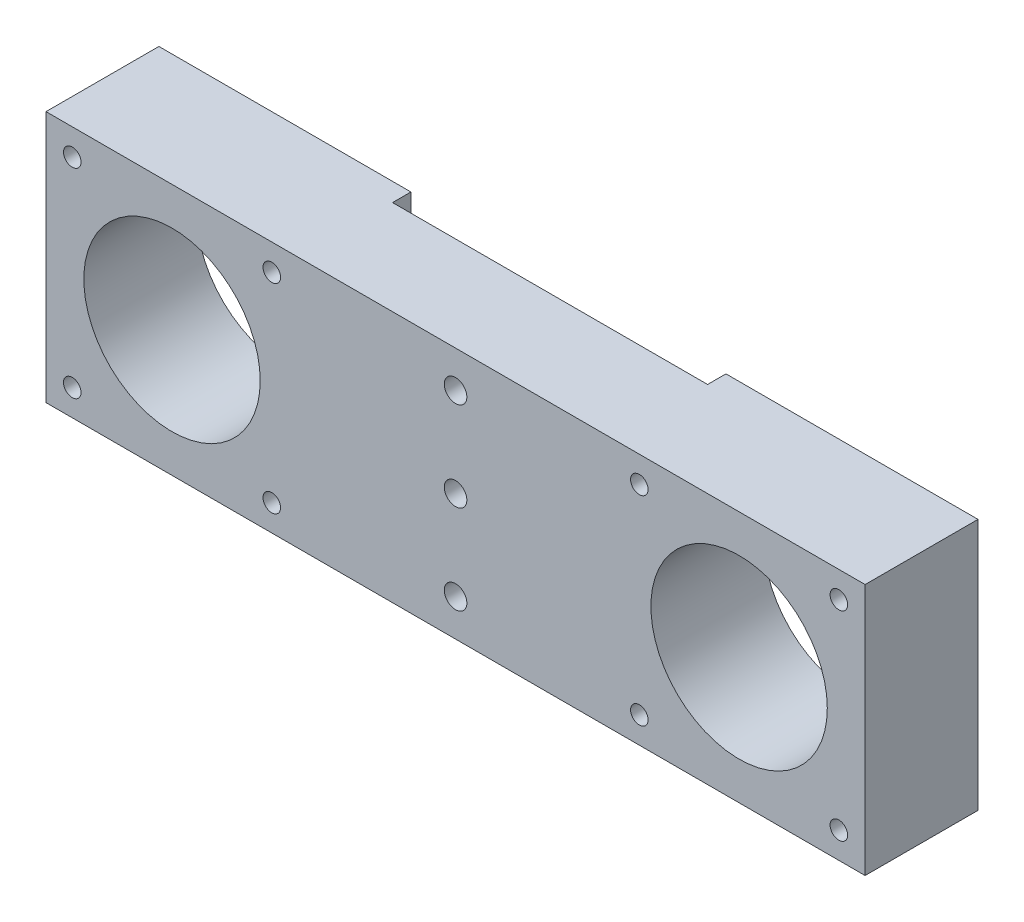
ISO-10303-21;
HEADER;
FILE_DESCRIPTION(('STEP AP214'),'2;1');
FILE_NAME('part.step','',(''),(''),'','','');
FILE_SCHEMA(('AUTOMOTIVE_DESIGN { 1 0 10303 214 1 1 1 1 }'));
ENDSEC;
DATA;
#1=APPLICATION_CONTEXT('core data for automotive mechanical design processes');
#2=APPLICATION_PROTOCOL_DEFINITION('international standard','automotive_design',2000,#1);
#3=PRODUCT_CONTEXT('',#1,'mechanical');
#4=PRODUCT('Part','Part','',(#3));
#5=PRODUCT_RELATED_PRODUCT_CATEGORY('part','',(#4));
#6=PRODUCT_DEFINITION_FORMATION('','',#4);
#7=PRODUCT_DEFINITION_CONTEXT('part definition',#1,'design');
#8=PRODUCT_DEFINITION('design','',#6,#7);
#9=PRODUCT_DEFINITION_SHAPE('','',#8);
#10=(LENGTH_UNIT() NAMED_UNIT(*) SI_UNIT(.MILLI.,.METRE.));
#11=(NAMED_UNIT(*) PLANE_ANGLE_UNIT() SI_UNIT($,.RADIAN.));
#12=(NAMED_UNIT(*) SI_UNIT($,.STERADIAN.) SOLID_ANGLE_UNIT());
#13=UNCERTAINTY_MEASURE_WITH_UNIT(LENGTH_MEASURE(1.E-05),#10,'distance_accuracy_value','');
#14=(GEOMETRIC_REPRESENTATION_CONTEXT(3) GLOBAL_UNCERTAINTY_ASSIGNED_CONTEXT((#13)) GLOBAL_UNIT_ASSIGNED_CONTEXT((#10,
#11,#12)) REPRESENTATION_CONTEXT('',''));
#15=CARTESIAN_POINT('',(0.,0.,0.));
#16=DIRECTION('',(0.,0.,1.));
#17=DIRECTION('',(1.,0.,0.));
#18=AXIS2_PLACEMENT_3D('',#15,#16,#17);
#19=CARTESIAN_POINT('',(0.,0.,21.5));
#20=DIRECTION('',(0.,0.,1.));
#21=DIRECTION('',(1.,0.,0.));
#22=AXIS2_PLACEMENT_3D('',#19,#20,#21);
#23=PLANE('',#22);
#24=CARTESIAN_POINT('',(19.,-19.,21.5));
#25=DIRECTION('',(0.,0.,1.));
#26=DIRECTION('',(1.,0.,0.));
#27=AXIS2_PLACEMENT_3D('',#24,#25,#26);
#28=CIRCLE('',#27,1.67000000000001);
#29=CARTESIAN_POINT('',(20.67,-19.,21.5));
#30=VERTEX_POINT('',#29);
#31=EDGE_CURVE('E140',#30,#30,#28,.T.);
#32=ORIENTED_EDGE('',*,*,#31,.F.);
#33=EDGE_LOOP('',(#32));
#34=FACE_BOUND('',#33,.T.);
#35=CARTESIAN_POINT('',(-19.,19.,21.5));
#36=DIRECTION('',(0.,0.,1.));
#37=DIRECTION('',(1.,0.,0.));
#38=AXIS2_PLACEMENT_3D('',#35,#36,#37);
#39=CIRCLE('',#38,1.67);
#40=CARTESIAN_POINT('',(-17.33,19.,21.5));
#41=VERTEX_POINT('',#40);
#42=EDGE_CURVE('E129',#41,#41,#39,.T.);
#43=ORIENTED_EDGE('',*,*,#42,.F.);
#44=EDGE_LOOP('',(#43));
#45=FACE_BOUND('',#44,.T.);
#46=DIRECTION('',(0.,-1.,0.));
#47=VECTOR('',#46,1.);
#48=CARTESIAN_POINT('',(-24.,-24.,21.5));
#49=LINE('',#48,#47);
#50=CARTESIAN_POINT('',(-24.,24.,21.5));
#51=VERTEX_POINT('',#50);
#52=CARTESIAN_POINT('',(-24.,-24.,21.5));
#53=VERTEX_POINT('',#52);
#54=EDGE_CURVE('E89',#51,#53,#49,.T.);
#55=ORIENTED_EDGE('',*,*,#54,.T.);
#56=DIRECTION('',(1.,0.,0.));
#57=VECTOR('',#56,1.);
#58=CARTESIAN_POINT('',(24.,-24.,21.5));
#59=LINE('',#58,#57);
#60=CARTESIAN_POINT('',(132.,-24.,21.5));
#61=VERTEX_POINT('',#60);
#62=EDGE_CURVE('E119',#53,#61,#59,.T.);
#63=ORIENTED_EDGE('',*,*,#62,.T.);
#64=DIRECTION('',(0.,1.,0.));
#65=VECTOR('',#64,1.);
#66=CARTESIAN_POINT('',(132.,-24.,21.5));
#67=LINE('',#66,#65);
#68=CARTESIAN_POINT('',(132.,24.,21.5));
#69=VERTEX_POINT('',#68);
#70=EDGE_CURVE('E189',#61,#69,#67,.T.);
#71=ORIENTED_EDGE('',*,*,#70,.T.);
#72=DIRECTION('',(-1.,0.,0.));
#73=VECTOR('',#72,1.);
#74=CARTESIAN_POINT('',(24.,24.,21.5));
#75=LINE('',#74,#73);
#76=EDGE_CURVE('E58',#69,#51,#75,.T.);
#77=ORIENTED_EDGE('',*,*,#76,.T.);
#78=EDGE_LOOP('',(#55,#63,#71,#77));
#79=FACE_BOUND('',#78,.T.);
#80=CARTESIAN_POINT('',(0.,0.,21.5));
#81=DIRECTION('',(0.,0.,1.));
#82=DIRECTION('',(1.,0.,0.));
#83=AXIS2_PLACEMENT_3D('',#80,#81,#82);
#84=CIRCLE('',#83,16.8);
#85=CARTESIAN_POINT('',(16.8,0.,21.5));
#86=VERTEX_POINT('',#85);
#87=EDGE_CURVE('E101',#86,#86,#84,.T.);
#88=ORIENTED_EDGE('',*,*,#87,.F.);
#89=EDGE_LOOP('',(#88));
#90=FACE_BOUND('',#89,.T.);
#91=CARTESIAN_POINT('',(19.,19.,21.5));
#92=DIRECTION('',(0.,0.,1.));
#93=DIRECTION('',(1.,0.,0.));
#94=AXIS2_PLACEMENT_3D('',#91,#92,#93);
#95=CIRCLE('',#94,1.67000000000001);
#96=CARTESIAN_POINT('',(20.67,19.,21.5));
#97=VERTEX_POINT('',#96);
#98=EDGE_CURVE('E134',#97,#97,#95,.T.);
#99=ORIENTED_EDGE('',*,*,#98,.F.);
#100=EDGE_LOOP('',(#99));
#101=FACE_BOUND('',#100,.T.);
#102=CARTESIAN_POINT('',(-19.,-19.,21.5));
#103=DIRECTION('',(0.,0.,1.));
#104=DIRECTION('',(1.,0.,0.));
#105=AXIS2_PLACEMENT_3D('',#102,#103,#104);
#106=CIRCLE('',#105,1.67);
#107=CARTESIAN_POINT('',(-17.33,-19.,21.5));
#108=VERTEX_POINT('',#107);
#109=EDGE_CURVE('E146',#108,#108,#106,.T.);
#110=ORIENTED_EDGE('',*,*,#109,.F.);
#111=EDGE_LOOP('',(#110));
#112=FACE_BOUND('',#111,.T.);
#113=CARTESIAN_POINT('',(54.,-17.,21.5));
#114=DIRECTION('',(0.,0.,1.));
#115=DIRECTION('',(1.,0.,0.));
#116=AXIS2_PLACEMENT_3D('',#113,#114,#115);
#117=CIRCLE('',#116,2.15);
#118=CARTESIAN_POINT('',(56.15,-17.,21.5));
#119=VERTEX_POINT('',#118);
#120=EDGE_CURVE('E174',#119,#119,#117,.T.);
#121=ORIENTED_EDGE('',*,*,#120,.F.);
#122=EDGE_LOOP('',(#121));
#123=FACE_BOUND('',#122,.T.);
#124=CARTESIAN_POINT('',(54.,0.,21.5));
#125=DIRECTION('',(0.,0.,1.));
#126=DIRECTION('',(1.,0.,0.));
#127=AXIS2_PLACEMENT_3D('',#124,#125,#126);
#128=CIRCLE('',#127,2.15);
#129=CARTESIAN_POINT('',(56.15,0.,21.5));
#130=VERTEX_POINT('',#129);
#131=EDGE_CURVE('E168',#130,#130,#128,.T.);
#132=ORIENTED_EDGE('',*,*,#131,.F.);
#133=EDGE_LOOP('',(#132));
#134=FACE_BOUND('',#133,.T.);
#135=CARTESIAN_POINT('',(54.,17.,21.5));
#136=DIRECTION('',(0.,0.,1.));
#137=DIRECTION('',(1.,0.,0.));
#138=AXIS2_PLACEMENT_3D('',#135,#136,#137);
#139=CIRCLE('',#138,2.15);
#140=CARTESIAN_POINT('',(56.15,17.,21.5));
#141=VERTEX_POINT('',#140);
#142=EDGE_CURVE('E162',#141,#141,#139,.T.);
#143=ORIENTED_EDGE('',*,*,#142,.F.);
#144=EDGE_LOOP('',(#143));
#145=FACE_BOUND('',#144,.T.);
#146=CARTESIAN_POINT('',(127.,-19.,21.5));
#147=DIRECTION('',(0.,0.,1.));
#148=DIRECTION('',(1.,0.,0.));
#149=AXIS2_PLACEMENT_3D('',#146,#147,#148);
#150=CIRCLE('',#149,1.67000000000001);
#151=CARTESIAN_POINT('',(128.67,-19.,21.5));
#152=VERTEX_POINT('',#151);
#153=EDGE_CURVE('E218',#152,#152,#150,.T.);
#154=ORIENTED_EDGE('',*,*,#153,.F.);
#155=EDGE_LOOP('',(#154));
#156=FACE_BOUND('',#155,.T.);
#157=CARTESIAN_POINT('',(89.,19.,21.5));
#158=DIRECTION('',(0.,0.,1.));
#159=DIRECTION('',(1.,0.,0.));
#160=AXIS2_PLACEMENT_3D('',#157,#158,#159);
#161=CIRCLE('',#160,1.67);
#162=CARTESIAN_POINT('',(90.67,19.,21.5));
#163=VERTEX_POINT('',#162);
#164=EDGE_CURVE('E206',#163,#163,#161,.T.);
#165=ORIENTED_EDGE('',*,*,#164,.F.);
#166=EDGE_LOOP('',(#165));
#167=FACE_BOUND('',#166,.T.);
#168=CARTESIAN_POINT('',(108.,0.,21.5));
#169=DIRECTION('',(0.,0.,1.));
#170=DIRECTION('',(1.,0.,0.));
#171=AXIS2_PLACEMENT_3D('',#168,#169,#170);
#172=CIRCLE('',#171,16.8);
#173=CARTESIAN_POINT('',(124.8,0.,21.5));
#174=VERTEX_POINT('',#173);
#175=EDGE_CURVE('E201',#174,#174,#172,.T.);
#176=ORIENTED_EDGE('',*,*,#175,.F.);
#177=EDGE_LOOP('',(#176));
#178=FACE_BOUND('',#177,.T.);
#179=CARTESIAN_POINT('',(127.,19.,21.5));
#180=DIRECTION('',(0.,0.,1.));
#181=DIRECTION('',(1.,0.,0.));
#182=AXIS2_PLACEMENT_3D('',#179,#180,#181);
#183=CIRCLE('',#182,1.67000000000001);
#184=CARTESIAN_POINT('',(128.67,19.,21.5));
#185=VERTEX_POINT('',#184);
#186=EDGE_CURVE('E212',#185,#185,#183,.T.);
#187=ORIENTED_EDGE('',*,*,#186,.F.);
#188=EDGE_LOOP('',(#187));
#189=FACE_BOUND('',#188,.T.);
#190=CARTESIAN_POINT('',(89.,-19.,21.5));
#191=DIRECTION('',(0.,0.,1.));
#192=DIRECTION('',(1.,0.,0.));
#193=AXIS2_PLACEMENT_3D('',#190,#191,#192);
#194=CIRCLE('',#193,1.67);
#195=CARTESIAN_POINT('',(90.67,-19.,21.5));
#196=VERTEX_POINT('',#195);
#197=EDGE_CURVE('E224',#196,#196,#194,.T.);
#198=ORIENTED_EDGE('',*,*,#197,.F.);
#199=EDGE_LOOP('',(#198));
#200=FACE_BOUND('',#199,.T.);
#201=ADVANCED_FACE('F34',(#34,#45,#79,#90,#101,#112,#123,#134,#145,#156,#167,#178,#189,#200),
#23,.T.);
#202=CARTESIAN_POINT('',(0.,0.,0.));
#203=DIRECTION('',(0.,0.,1.));
#204=DIRECTION('',(1.,0.,0.));
#205=AXIS2_PLACEMENT_3D('',#202,#203,#204);
#206=PLANE('',#205);
#207=DIRECTION('',(0.,-1.,0.));
#208=VECTOR('',#207,1.);
#209=CARTESIAN_POINT('',(-24.,-24.,0.));
#210=LINE('',#209,#208);
#211=CARTESIAN_POINT('',(-24.,24.,0.));
#212=VERTEX_POINT('',#211);
#213=CARTESIAN_POINT('',(-24.,-24.,0.));
#214=VERTEX_POINT('',#213);
#215=EDGE_CURVE('E95',#212,#214,#210,.T.);
#216=ORIENTED_EDGE('',*,*,#215,.F.);
#217=DIRECTION('',(-1.,0.,0.));
#218=VECTOR('',#217,1.);
#219=CARTESIAN_POINT('',(24.,24.,0.));
#220=LINE('',#219,#218);
#221=CARTESIAN_POINT('',(24.,24.,0.));
#222=VERTEX_POINT('',#221);
#223=EDGE_CURVE('E77',#222,#212,#220,.T.);
#224=ORIENTED_EDGE('',*,*,#223,.F.);
#225=DIRECTION('',(0.,1.,0.));
#226=VECTOR('',#225,1.);
#227=CARTESIAN_POINT('',(24.,-24.,0.));
#228=LINE('',#227,#226);
#229=CARTESIAN_POINT('',(24.,-24.,0.));
#230=VERTEX_POINT('',#229);
#231=EDGE_CURVE('E90',#230,#222,#228,.T.);
#232=ORIENTED_EDGE('',*,*,#231,.F.);
#233=DIRECTION('',(1.,0.,0.));
#234=VECTOR('',#233,1.);
#235=CARTESIAN_POINT('',(24.,-24.,0.));
#236=LINE('',#235,#234);
#237=EDGE_CURVE('E100',#214,#230,#236,.T.);
#238=ORIENTED_EDGE('',*,*,#237,.F.);
#239=EDGE_LOOP('',(#216,#224,#232,#238));
#240=FACE_BOUND('',#239,.T.);
#241=CARTESIAN_POINT('',(0.,0.,0.));
#242=DIRECTION('',(0.,0.,1.));
#243=DIRECTION('',(1.,0.,0.));
#244=AXIS2_PLACEMENT_3D('',#241,#242,#243);
#245=CIRCLE('',#244,16.8);
#246=CARTESIAN_POINT('',(16.8,0.,0.));
#247=VERTEX_POINT('',#246);
#248=EDGE_CURVE('E105',#247,#247,#245,.T.);
#249=ORIENTED_EDGE('',*,*,#248,.T.);
#250=EDGE_LOOP('',(#249));
#251=FACE_BOUND('',#250,.T.);
#252=CARTESIAN_POINT('',(-19.,19.,0.));
#253=DIRECTION('',(0.,0.,1.));
#254=DIRECTION('',(1.,0.,0.));
#255=AXIS2_PLACEMENT_3D('',#252,#253,#254);
#256=CIRCLE('',#255,1.67);
#257=CARTESIAN_POINT('',(-17.33,19.,0.));
#258=VERTEX_POINT('',#257);
#259=EDGE_CURVE('E131',#258,#258,#256,.T.);
#260=ORIENTED_EDGE('',*,*,#259,.T.);
#261=EDGE_LOOP('',(#260));
#262=FACE_BOUND('',#261,.T.);
#263=CARTESIAN_POINT('',(19.,19.,0.));
#264=DIRECTION('',(0.,0.,1.));
#265=DIRECTION('',(1.,0.,0.));
#266=AXIS2_PLACEMENT_3D('',#263,#264,#265);
#267=CIRCLE('',#266,1.67000000000001);
#268=CARTESIAN_POINT('',(20.67,19.,0.));
#269=VERTEX_POINT('',#268);
#270=EDGE_CURVE('E137',#269,#269,#267,.T.);
#271=ORIENTED_EDGE('',*,*,#270,.T.);
#272=EDGE_LOOP('',(#271));
#273=FACE_BOUND('',#272,.T.);
#274=CARTESIAN_POINT('',(19.,-19.,0.));
#275=DIRECTION('',(0.,0.,1.));
#276=DIRECTION('',(1.,0.,0.));
#277=AXIS2_PLACEMENT_3D('',#274,#275,#276);
#278=CIRCLE('',#277,1.67000000000001);
#279=CARTESIAN_POINT('',(20.67,-19.,0.));
#280=VERTEX_POINT('',#279);
#281=EDGE_CURVE('E143',#280,#280,#278,.T.);
#282=ORIENTED_EDGE('',*,*,#281,.T.);
#283=EDGE_LOOP('',(#282));
#284=FACE_BOUND('',#283,.T.);
#285=CARTESIAN_POINT('',(-19.,-19.,0.));
#286=DIRECTION('',(0.,0.,1.));
#287=DIRECTION('',(1.,0.,0.));
#288=AXIS2_PLACEMENT_3D('',#285,#286,#287);
#289=CIRCLE('',#288,1.67);
#290=CARTESIAN_POINT('',(-17.33,-19.,0.));
#291=VERTEX_POINT('',#290);
#292=EDGE_CURVE('E149',#291,#291,#289,.T.);
#293=ORIENTED_EDGE('',*,*,#292,.T.);
#294=EDGE_LOOP('',(#293));
#295=FACE_BOUND('',#294,.T.);
#296=ADVANCED_FACE('F97',(#240,#251,#262,#273,#284,#295),#206,.F.);
#297=CARTESIAN_POINT('',(-24.,-24.,21.5));
#298=DIRECTION('',(1.,0.,0.));
#299=DIRECTION('',(0.,0.,-1.));
#300=AXIS2_PLACEMENT_3D('',#297,#298,#299);
#301=PLANE('',#300);
#302=ORIENTED_EDGE('',*,*,#215,.T.);
#303=DIRECTION('',(0.,0.,-1.));
#304=VECTOR('',#303,1.);
#305=CARTESIAN_POINT('',(-24.,-24.,21.5));
#306=LINE('',#305,#304);
#307=EDGE_CURVE('E11',#53,#214,#306,.T.);
#308=ORIENTED_EDGE('',*,*,#307,.F.);
#309=ORIENTED_EDGE('',*,*,#54,.F.);
#310=DIRECTION('',(0.,0.,-1.));
#311=VECTOR('',#310,1.);
#312=CARTESIAN_POINT('',(-24.,24.,21.5));
#313=LINE('',#312,#311);
#314=EDGE_CURVE('E80',#51,#212,#313,.T.);
#315=ORIENTED_EDGE('',*,*,#314,.T.);
#316=EDGE_LOOP('',(#302,#308,#309,#315));
#317=FACE_BOUND('',#316,.T.);
#318=ADVANCED_FACE('F36',(#317),#301,.F.);
#319=CARTESIAN_POINT('',(24.,-24.,21.5));
#320=DIRECTION('',(0.,1.,0.));
#321=DIRECTION('',(-1.,0.,0.));
#322=AXIS2_PLACEMENT_3D('',#319,#320,#321);
#323=PLANE('',#322);
#324=ORIENTED_EDGE('',*,*,#237,.T.);
#325=DIRECTION('',(0.,0.,-1.));
#326=VECTOR('',#325,1.);
#327=CARTESIAN_POINT('',(24.,-24.,21.5));
#328=LINE('',#327,#326);
#329=CARTESIAN_POINT('',(24.,-24.,3.5));
#330=VERTEX_POINT('',#329);
#331=EDGE_CURVE('E42',#330,#230,#328,.T.);
#332=ORIENTED_EDGE('',*,*,#331,.F.);
#333=DIRECTION('',(1.,0.,0.));
#334=VECTOR('',#333,1.);
#335=CARTESIAN_POINT('',(24.,-24.,3.5));
#336=LINE('',#335,#334);
#337=CARTESIAN_POINT('',(84.,-24.,3.5));
#338=VERTEX_POINT('',#337);
#339=EDGE_CURVE('E49',#330,#338,#336,.T.);
#340=ORIENTED_EDGE('',*,*,#339,.T.);
#341=DIRECTION('',(0.,0.,-1.));
#342=VECTOR('',#341,1.);
#343=CARTESIAN_POINT('',(84.,-24.,21.5));
#344=LINE('',#343,#342);
#345=CARTESIAN_POINT('',(84.,-24.,0.));
#346=VERTEX_POINT('',#345);
#347=EDGE_CURVE('E177',#338,#346,#344,.T.);
#348=ORIENTED_EDGE('',*,*,#347,.T.);
#349=DIRECTION('',(1.,0.,0.));
#350=VECTOR('',#349,1.);
#351=CARTESIAN_POINT('',(132.,-24.,0.));
#352=LINE('',#351,#350);
#353=CARTESIAN_POINT('',(132.,-24.,0.));
#354=VERTEX_POINT('',#353);
#355=EDGE_CURVE('E196',#346,#354,#352,.T.);
#356=ORIENTED_EDGE('',*,*,#355,.T.);
#357=DIRECTION('',(0.,0.,-1.));
#358=VECTOR('',#357,1.);
#359=CARTESIAN_POINT('',(132.,-24.,21.5));
#360=LINE('',#359,#358);
#361=EDGE_CURVE('E123',#61,#354,#360,.T.);
#362=ORIENTED_EDGE('',*,*,#361,.F.);
#363=ORIENTED_EDGE('',*,*,#62,.F.);
#364=ORIENTED_EDGE('',*,*,#307,.T.);
#365=EDGE_LOOP('',(#324,#332,#340,#348,#356,#362,#363,#364));
#366=FACE_BOUND('',#365,.T.);
#367=ADVANCED_FACE('F116',(#366),#323,.F.);
#368=CARTESIAN_POINT('',(24.,-24.,21.5));
#369=DIRECTION('',(-1.,0.,0.));
#370=DIRECTION('',(0.,0.,1.));
#371=AXIS2_PLACEMENT_3D('',#368,#369,#370);
#372=PLANE('',#371);
#373=DIRECTION('',(0.,0.,-1.));
#374=VECTOR('',#373,1.);
#375=CARTESIAN_POINT('',(24.,24.,21.5));
#376=LINE('',#375,#374);
#377=CARTESIAN_POINT('',(24.,24.,3.5));
#378=VERTEX_POINT('',#377);
#379=EDGE_CURVE('E84',#378,#222,#376,.T.);
#380=ORIENTED_EDGE('',*,*,#379,.F.);
#381=DIRECTION('',(0.,-1.,0.));
#382=VECTOR('',#381,1.);
#383=CARTESIAN_POINT('',(24.,24.,3.5));
#384=LINE('',#383,#382);
#385=EDGE_CURVE('E114',#378,#330,#384,.T.);
#386=ORIENTED_EDGE('',*,*,#385,.T.);
#387=ORIENTED_EDGE('',*,*,#331,.T.);
#388=ORIENTED_EDGE('',*,*,#231,.T.);
#389=EDGE_LOOP('',(#380,#386,#387,#388));
#390=FACE_BOUND('',#389,.T.);
#391=ADVANCED_FACE('F113',(#390),#372,.F.);
#392=CARTESIAN_POINT('',(24.,24.,21.5));
#393=DIRECTION('',(0.,-1.,0.));
#394=DIRECTION('',(1.,0.,0.));
#395=AXIS2_PLACEMENT_3D('',#392,#393,#394);
#396=PLANE('',#395);
#397=ORIENTED_EDGE('',*,*,#223,.T.);
#398=ORIENTED_EDGE('',*,*,#314,.F.);
#399=ORIENTED_EDGE('',*,*,#76,.F.);
#400=DIRECTION('',(0.,0.,-1.));
#401=VECTOR('',#400,1.);
#402=CARTESIAN_POINT('',(132.,24.,21.5));
#403=LINE('',#402,#401);
#404=CARTESIAN_POINT('',(132.,24.,0.));
#405=VERTEX_POINT('',#404);
#406=EDGE_CURVE('E183',#69,#405,#403,.T.);
#407=ORIENTED_EDGE('',*,*,#406,.T.);
#408=DIRECTION('',(-1.,0.,0.));
#409=VECTOR('',#408,1.);
#410=CARTESIAN_POINT('',(132.,24.,0.));
#411=LINE('',#410,#409);
#412=CARTESIAN_POINT('',(84.,24.,0.));
#413=VERTEX_POINT('',#412);
#414=EDGE_CURVE('E190',#405,#413,#411,.T.);
#415=ORIENTED_EDGE('',*,*,#414,.T.);
#416=DIRECTION('',(0.,0.,-1.));
#417=VECTOR('',#416,1.);
#418=CARTESIAN_POINT('',(84.,24.,21.5));
#419=LINE('',#418,#417);
#420=CARTESIAN_POINT('',(84.,24.,3.5));
#421=VERTEX_POINT('',#420);
#422=EDGE_CURVE('E186',#421,#413,#419,.T.);
#423=ORIENTED_EDGE('',*,*,#422,.F.);
#424=DIRECTION('',(-1.,0.,0.));
#425=VECTOR('',#424,1.);
#426=CARTESIAN_POINT('',(84.,24.,3.5));
#427=LINE('',#426,#425);
#428=EDGE_CURVE('E156',#421,#378,#427,.T.);
#429=ORIENTED_EDGE('',*,*,#428,.T.);
#430=ORIENTED_EDGE('',*,*,#379,.T.);
#431=EDGE_LOOP('',(#397,#398,#399,#407,#415,#423,#429,#430));
#432=FACE_BOUND('',#431,.T.);
#433=ADVANCED_FACE('F79',(#432),#396,.F.);
#434=CARTESIAN_POINT('',(0.,0.,21.5));
#435=DIRECTION('',(0.,0.,-1.));
#436=DIRECTION('',(-1.,0.,0.));
#437=AXIS2_PLACEMENT_3D('',#434,#435,#436);
#438=CYLINDRICAL_SURFACE('',#437,16.8);
#439=ORIENTED_EDGE('',*,*,#87,.T.);
#440=EDGE_LOOP('',(#439));
#441=FACE_BOUND('',#440,.T.);
#442=ORIENTED_EDGE('',*,*,#248,.F.);
#443=EDGE_LOOP('',(#442));
#444=FACE_BOUND('',#443,.T.);
#445=ADVANCED_FACE('F246',(#441,#444),#438,.F.);
#446=CARTESIAN_POINT('',(-19.,19.,21.5));
#447=DIRECTION('',(0.,0.,-1.));
#448=DIRECTION('',(-1.,0.,0.));
#449=AXIS2_PLACEMENT_3D('',#446,#447,#448);
#450=CYLINDRICAL_SURFACE('',#449,1.67);
#451=ORIENTED_EDGE('',*,*,#42,.T.);
#452=EDGE_LOOP('',(#451));
#453=FACE_BOUND('',#452,.T.);
#454=ORIENTED_EDGE('',*,*,#259,.F.);
#455=EDGE_LOOP('',(#454));
#456=FACE_BOUND('',#455,.T.);
#457=ADVANCED_FACE('F300',(#453,#456),#450,.F.);
#458=CARTESIAN_POINT('',(19.,19.,21.5));
#459=DIRECTION('',(0.,0.,-1.));
#460=DIRECTION('',(-1.,0.,0.));
#461=AXIS2_PLACEMENT_3D('',#458,#459,#460);
#462=CYLINDRICAL_SURFACE('',#461,1.67000000000001);
#463=ORIENTED_EDGE('',*,*,#98,.T.);
#464=EDGE_LOOP('',(#463));
#465=FACE_BOUND('',#464,.T.);
#466=ORIENTED_EDGE('',*,*,#270,.F.);
#467=EDGE_LOOP('',(#466));
#468=FACE_BOUND('',#467,.T.);
#469=ADVANCED_FACE('F308',(#465,#468),#462,.F.);
#470=CARTESIAN_POINT('',(19.,-19.,21.5));
#471=DIRECTION('',(0.,0.,-1.));
#472=DIRECTION('',(-1.,0.,0.));
#473=AXIS2_PLACEMENT_3D('',#470,#471,#472);
#474=CYLINDRICAL_SURFACE('',#473,1.67000000000001);
#475=ORIENTED_EDGE('',*,*,#31,.T.);
#476=EDGE_LOOP('',(#475));
#477=FACE_BOUND('',#476,.T.);
#478=ORIENTED_EDGE('',*,*,#281,.F.);
#479=EDGE_LOOP('',(#478));
#480=FACE_BOUND('',#479,.T.);
#481=ADVANCED_FACE('F316',(#477,#480),#474,.F.);
#482=CARTESIAN_POINT('',(-19.,-19.,21.5));
#483=DIRECTION('',(0.,0.,-1.));
#484=DIRECTION('',(-1.,0.,0.));
#485=AXIS2_PLACEMENT_3D('',#482,#483,#484);
#486=CYLINDRICAL_SURFACE('',#485,1.67);
#487=ORIENTED_EDGE('',*,*,#109,.T.);
#488=EDGE_LOOP('',(#487));
#489=FACE_BOUND('',#488,.T.);
#490=ORIENTED_EDGE('',*,*,#292,.F.);
#491=EDGE_LOOP('',(#490));
#492=FACE_BOUND('',#491,.T.);
#493=ADVANCED_FACE('F325',(#489,#492),#486,.F.);
#494=CARTESIAN_POINT('',(0.,0.,3.5));
#495=DIRECTION('',(0.,0.,1.));
#496=DIRECTION('',(1.,0.,0.));
#497=AXIS2_PLACEMENT_3D('',#494,#495,#496);
#498=PLANE('',#497);
#499=CARTESIAN_POINT('',(54.,-17.,3.5));
#500=DIRECTION('',(0.,0.,1.));
#501=DIRECTION('',(1.,0.,0.));
#502=AXIS2_PLACEMENT_3D('',#499,#500,#501);
#503=CIRCLE('',#502,2.15);
#504=CARTESIAN_POINT('',(56.15,-17.,3.5));
#505=VERTEX_POINT('',#504);
#506=EDGE_CURVE('E171',#505,#505,#503,.T.);
#507=ORIENTED_EDGE('',*,*,#506,.T.);
#508=EDGE_LOOP('',(#507));
#509=FACE_BOUND('',#508,.T.);
#510=CARTESIAN_POINT('',(54.,0.,3.5));
#511=DIRECTION('',(0.,0.,1.));
#512=DIRECTION('',(1.,0.,0.));
#513=AXIS2_PLACEMENT_3D('',#510,#511,#512);
#514=CIRCLE('',#513,2.15);
#515=CARTESIAN_POINT('',(56.15,0.,3.5));
#516=VERTEX_POINT('',#515);
#517=EDGE_CURVE('E165',#516,#516,#514,.T.);
#518=ORIENTED_EDGE('',*,*,#517,.T.);
#519=EDGE_LOOP('',(#518));
#520=FACE_BOUND('',#519,.T.);
#521=CARTESIAN_POINT('',(54.,17.,3.5));
#522=DIRECTION('',(0.,0.,1.));
#523=DIRECTION('',(1.,0.,0.));
#524=AXIS2_PLACEMENT_3D('',#521,#522,#523);
#525=CIRCLE('',#524,2.15);
#526=CARTESIAN_POINT('',(56.15,17.,3.5));
#527=VERTEX_POINT('',#526);
#528=EDGE_CURVE('E161',#527,#527,#525,.T.);
#529=ORIENTED_EDGE('',*,*,#528,.T.);
#530=EDGE_LOOP('',(#529));
#531=FACE_BOUND('',#530,.T.);
#532=DIRECTION('',(0.,1.,0.));
#533=VECTOR('',#532,1.);
#534=CARTESIAN_POINT('',(84.,-24.,3.5));
#535=LINE('',#534,#533);
#536=EDGE_CURVE('E158',#338,#421,#535,.T.);
#537=ORIENTED_EDGE('',*,*,#536,.F.);
#538=ORIENTED_EDGE('',*,*,#339,.F.);
#539=ORIENTED_EDGE('',*,*,#385,.F.);
#540=ORIENTED_EDGE('',*,*,#428,.F.);
#541=EDGE_LOOP('',(#537,#538,#539,#540));
#542=FACE_BOUND('',#541,.T.);
#543=ADVANCED_FACE('F332',(#509,#520,#531,#542),#498,.F.);
#544=CARTESIAN_POINT('',(54.,17.,3.5));
#545=DIRECTION('',(0.,0.,1.));
#546=DIRECTION('',(1.,0.,0.));
#547=AXIS2_PLACEMENT_3D('',#544,#545,#546);
#548=CYLINDRICAL_SURFACE('',#547,2.15);
#549=ORIENTED_EDGE('',*,*,#528,.F.);
#550=EDGE_LOOP('',(#549));
#551=FACE_BOUND('',#550,.T.);
#552=ORIENTED_EDGE('',*,*,#142,.T.);
#553=EDGE_LOOP('',(#552));
#554=FACE_BOUND('',#553,.T.);
#555=ADVANCED_FACE('F444',(#551,#554),#548,.F.);
#556=CARTESIAN_POINT('',(54.,0.,3.5));
#557=DIRECTION('',(0.,0.,1.));
#558=DIRECTION('',(1.,0.,0.));
#559=AXIS2_PLACEMENT_3D('',#556,#557,#558);
#560=CYLINDRICAL_SURFACE('',#559,2.15);
#561=ORIENTED_EDGE('',*,*,#517,.F.);
#562=EDGE_LOOP('',(#561));
#563=FACE_BOUND('',#562,.T.);
#564=ORIENTED_EDGE('',*,*,#131,.T.);
#565=EDGE_LOOP('',(#564));
#566=FACE_BOUND('',#565,.T.);
#567=ADVANCED_FACE('F437',(#563,#566),#560,.F.);
#568=CARTESIAN_POINT('',(54.,-17.,3.5));
#569=DIRECTION('',(0.,0.,1.));
#570=DIRECTION('',(1.,0.,0.));
#571=AXIS2_PLACEMENT_3D('',#568,#569,#570);
#572=CYLINDRICAL_SURFACE('',#571,2.15);
#573=ORIENTED_EDGE('',*,*,#506,.F.);
#574=EDGE_LOOP('',(#573));
#575=FACE_BOUND('',#574,.T.);
#576=ORIENTED_EDGE('',*,*,#120,.T.);
#577=EDGE_LOOP('',(#576));
#578=FACE_BOUND('',#577,.T.);
#579=ADVANCED_FACE('F344',(#575,#578),#572,.F.);
#580=CARTESIAN_POINT('',(84.,-24.,21.5));
#581=DIRECTION('',(1.,0.,0.));
#582=DIRECTION('',(0.,0.,-1.));
#583=AXIS2_PLACEMENT_3D('',#580,#581,#582);
#584=PLANE('',#583);
#585=ORIENTED_EDGE('',*,*,#347,.F.);
#586=ORIENTED_EDGE('',*,*,#536,.T.);
#587=ORIENTED_EDGE('',*,*,#422,.T.);
#588=DIRECTION('',(0.,-1.,0.));
#589=VECTOR('',#588,1.);
#590=CARTESIAN_POINT('',(84.,-24.,0.));
#591=LINE('',#590,#589);
#592=EDGE_CURVE('E198',#413,#346,#591,.T.);
#593=ORIENTED_EDGE('',*,*,#592,.T.);
#594=EDGE_LOOP('',(#585,#586,#587,#593));
#595=FACE_BOUND('',#594,.T.);
#596=ADVANCED_FACE('F357',(#595),#584,.F.);
#597=CARTESIAN_POINT('',(108.,0.,0.));
#598=DIRECTION('',(0.,0.,1.));
#599=DIRECTION('',(1.,0.,0.));
#600=AXIS2_PLACEMENT_3D('',#597,#598,#599);
#601=PLANE('',#600);
#602=ORIENTED_EDGE('',*,*,#592,.F.);
#603=ORIENTED_EDGE('',*,*,#414,.F.);
#604=DIRECTION('',(0.,1.,0.));
#605=VECTOR('',#604,1.);
#606=CARTESIAN_POINT('',(132.,-24.,0.));
#607=LINE('',#606,#605);
#608=EDGE_CURVE('E193',#354,#405,#607,.T.);
#609=ORIENTED_EDGE('',*,*,#608,.F.);
#610=ORIENTED_EDGE('',*,*,#355,.F.);
#611=EDGE_LOOP('',(#602,#603,#609,#610));
#612=FACE_BOUND('',#611,.T.);
#613=CARTESIAN_POINT('',(108.,0.,0.));
#614=DIRECTION('',(0.,0.,1.));
#615=DIRECTION('',(1.,0.,0.));
#616=AXIS2_PLACEMENT_3D('',#613,#614,#615);
#617=CIRCLE('',#616,16.8);
#618=CARTESIAN_POINT('',(124.8,0.,0.));
#619=VERTEX_POINT('',#618);
#620=EDGE_CURVE('E203',#619,#619,#617,.T.);
#621=ORIENTED_EDGE('',*,*,#620,.T.);
#622=EDGE_LOOP('',(#621));
#623=FACE_BOUND('',#622,.T.);
#624=CARTESIAN_POINT('',(89.,19.,0.));
#625=DIRECTION('',(0.,0.,1.));
#626=DIRECTION('',(1.,0.,0.));
#627=AXIS2_PLACEMENT_3D('',#624,#625,#626);
#628=CIRCLE('',#627,1.67);
#629=CARTESIAN_POINT('',(90.67,19.,0.));
#630=VERTEX_POINT('',#629);
#631=EDGE_CURVE('E209',#630,#630,#628,.T.);
#632=ORIENTED_EDGE('',*,*,#631,.T.);
#633=EDGE_LOOP('',(#632));
#634=FACE_BOUND('',#633,.T.);
#635=CARTESIAN_POINT('',(127.,19.,0.));
#636=DIRECTION('',(0.,0.,1.));
#637=DIRECTION('',(1.,0.,0.));
#638=AXIS2_PLACEMENT_3D('',#635,#636,#637);
#639=CIRCLE('',#638,1.67000000000001);
#640=CARTESIAN_POINT('',(128.67,19.,0.));
#641=VERTEX_POINT('',#640);
#642=EDGE_CURVE('E215',#641,#641,#639,.T.);
#643=ORIENTED_EDGE('',*,*,#642,.T.);
#644=EDGE_LOOP('',(#643));
#645=FACE_BOUND('',#644,.T.);
#646=CARTESIAN_POINT('',(127.,-19.,0.));
#647=DIRECTION('',(0.,0.,1.));
#648=DIRECTION('',(1.,0.,0.));
#649=AXIS2_PLACEMENT_3D('',#646,#647,#648);
#650=CIRCLE('',#649,1.67000000000001);
#651=CARTESIAN_POINT('',(128.67,-19.,0.));
#652=VERTEX_POINT('',#651);
#653=EDGE_CURVE('E221',#652,#652,#650,.T.);
#654=ORIENTED_EDGE('',*,*,#653,.T.);
#655=EDGE_LOOP('',(#654));
#656=FACE_BOUND('',#655,.T.);
#657=CARTESIAN_POINT('',(89.,-19.,0.));
#658=DIRECTION('',(0.,0.,1.));
#659=DIRECTION('',(1.,0.,0.));
#660=AXIS2_PLACEMENT_3D('',#657,#658,#659);
#661=CIRCLE('',#660,1.67);
#662=CARTESIAN_POINT('',(90.67,-19.,0.));
#663=VERTEX_POINT('',#662);
#664=EDGE_CURVE('E227',#663,#663,#661,.T.);
#665=ORIENTED_EDGE('',*,*,#664,.T.);
#666=EDGE_LOOP('',(#665));
#667=FACE_BOUND('',#666,.T.);
#668=ADVANCED_FACE('F363',(#612,#623,#634,#645,#656,#667),#601,.F.);
#669=CARTESIAN_POINT('',(132.,-24.,21.5));
#670=DIRECTION('',(-1.,0.,0.));
#671=DIRECTION('',(0.,0.,1.));
#672=AXIS2_PLACEMENT_3D('',#669,#670,#671);
#673=PLANE('',#672);
#674=ORIENTED_EDGE('',*,*,#608,.T.);
#675=ORIENTED_EDGE('',*,*,#406,.F.);
#676=ORIENTED_EDGE('',*,*,#70,.F.);
#677=ORIENTED_EDGE('',*,*,#361,.T.);
#678=EDGE_LOOP('',(#674,#675,#676,#677));
#679=FACE_BOUND('',#678,.T.);
#680=ADVANCED_FACE('F372',(#679),#673,.F.);
#681=CARTESIAN_POINT('',(108.,0.,21.5));
#682=DIRECTION('',(0.,0.,-1.));
#683=DIRECTION('',(-1.,0.,0.));
#684=AXIS2_PLACEMENT_3D('',#681,#682,#683);
#685=CYLINDRICAL_SURFACE('',#684,16.8);
#686=ORIENTED_EDGE('',*,*,#175,.T.);
#687=EDGE_LOOP('',(#686));
#688=FACE_BOUND('',#687,.T.);
#689=ORIENTED_EDGE('',*,*,#620,.F.);
#690=EDGE_LOOP('',(#689));
#691=FACE_BOUND('',#690,.T.);
#692=ADVANCED_FACE('F381',(#688,#691),#685,.F.);
#693=CARTESIAN_POINT('',(89.,19.,21.5));
#694=DIRECTION('',(0.,0.,-1.));
#695=DIRECTION('',(-1.,0.,0.));
#696=AXIS2_PLACEMENT_3D('',#693,#694,#695);
#697=CYLINDRICAL_SURFACE('',#696,1.67);
#698=ORIENTED_EDGE('',*,*,#164,.T.);
#699=EDGE_LOOP('',(#698));
#700=FACE_BOUND('',#699,.T.);
#701=ORIENTED_EDGE('',*,*,#631,.F.);
#702=EDGE_LOOP('',(#701));
#703=FACE_BOUND('',#702,.T.);
#704=ADVANCED_FACE('F390',(#700,#703),#697,.F.);
#705=CARTESIAN_POINT('',(127.,19.,21.5));
#706=DIRECTION('',(0.,0.,-1.));
#707=DIRECTION('',(-1.,0.,0.));
#708=AXIS2_PLACEMENT_3D('',#705,#706,#707);
#709=CYLINDRICAL_SURFACE('',#708,1.67000000000001);
#710=ORIENTED_EDGE('',*,*,#186,.T.);
#711=EDGE_LOOP('',(#710));
#712=FACE_BOUND('',#711,.T.);
#713=ORIENTED_EDGE('',*,*,#642,.F.);
#714=EDGE_LOOP('',(#713));
#715=FACE_BOUND('',#714,.T.);
#716=ADVANCED_FACE('F399',(#712,#715),#709,.F.);
#717=CARTESIAN_POINT('',(127.,-19.,21.5));
#718=DIRECTION('',(0.,0.,-1.));
#719=DIRECTION('',(-1.,0.,0.));
#720=AXIS2_PLACEMENT_3D('',#717,#718,#719);
#721=CYLINDRICAL_SURFACE('',#720,1.67000000000001);
#722=ORIENTED_EDGE('',*,*,#153,.T.);
#723=EDGE_LOOP('',(#722));
#724=FACE_BOUND('',#723,.T.);
#725=ORIENTED_EDGE('',*,*,#653,.F.);
#726=EDGE_LOOP('',(#725));
#727=FACE_BOUND('',#726,.T.);
#728=ADVANCED_FACE('F408',(#724,#727),#721,.F.);
#729=CARTESIAN_POINT('',(89.,-19.,21.5));
#730=DIRECTION('',(0.,0.,-1.));
#731=DIRECTION('',(-1.,0.,0.));
#732=AXIS2_PLACEMENT_3D('',#729,#730,#731);
#733=CYLINDRICAL_SURFACE('',#732,1.67);
#734=ORIENTED_EDGE('',*,*,#197,.T.);
#735=EDGE_LOOP('',(#734));
#736=FACE_BOUND('',#735,.T.);
#737=ORIENTED_EDGE('',*,*,#664,.F.);
#738=EDGE_LOOP('',(#737));
#739=FACE_BOUND('',#738,.T.);
#740=ADVANCED_FACE('F233',(#736,#739),#733,.F.);
#741=CLOSED_SHELL('',(#201,#296,#318,#367,#391,#433,#445,#457,#469,#481,#493,#543,#555,#567,
#579,#596,#668,#680,#692,#704,#716,#728,#740));
#742=MANIFOLD_SOLID_BREP('B2',#741);
#743=ADVANCED_BREP_SHAPE_REPRESENTATION('',(#18,#742),#14);
#744=SHAPE_DEFINITION_REPRESENTATION(#9,#743);
ENDSEC;
END-ISO-10303-21;
